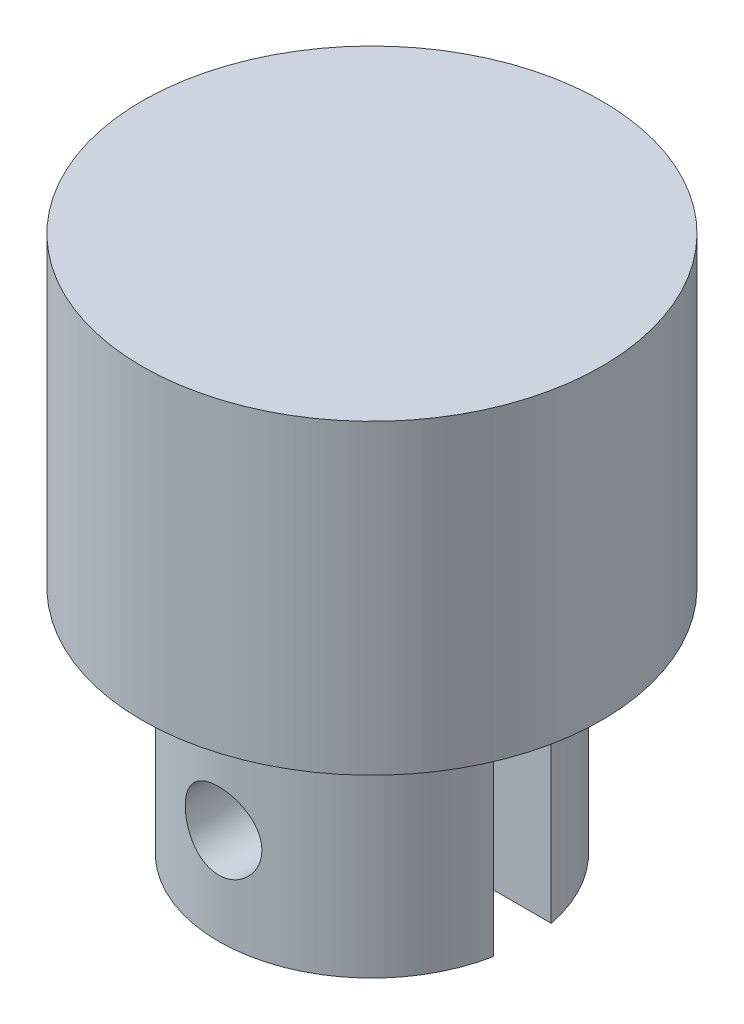
ISO-10303-21;
HEADER;
FILE_DESCRIPTION(('STEP AP214'),'2;1');
FILE_NAME('part.step','',(''),(''),'','','');
FILE_SCHEMA(('AUTOMOTIVE_DESIGN { 1 0 10303 214 1 1 1 1 }'));
ENDSEC;
DATA;
#1=APPLICATION_CONTEXT('core data for automotive mechanical design processes');
#2=APPLICATION_PROTOCOL_DEFINITION('international standard','automotive_design',2000,#1);
#3=PRODUCT_CONTEXT('',#1,'mechanical');
#4=PRODUCT('Part','Part','',(#3));
#5=PRODUCT_RELATED_PRODUCT_CATEGORY('part','',(#4));
#6=PRODUCT_DEFINITION_FORMATION('','',#4);
#7=PRODUCT_DEFINITION_CONTEXT('part definition',#1,'design');
#8=PRODUCT_DEFINITION('design','',#6,#7);
#9=PRODUCT_DEFINITION_SHAPE('','',#8);
#10=(LENGTH_UNIT() NAMED_UNIT(*) SI_UNIT(.MILLI.,.METRE.));
#11=(NAMED_UNIT(*) PLANE_ANGLE_UNIT() SI_UNIT($,.RADIAN.));
#12=(NAMED_UNIT(*) SI_UNIT($,.STERADIAN.) SOLID_ANGLE_UNIT());
#13=UNCERTAINTY_MEASURE_WITH_UNIT(LENGTH_MEASURE(1.E-05),#10,'distance_accuracy_value','');
#14=(GEOMETRIC_REPRESENTATION_CONTEXT(3) GLOBAL_UNCERTAINTY_ASSIGNED_CONTEXT((#13)) GLOBAL_UNIT_ASSIGNED_CONTEXT((#10,
#11,#12)) REPRESENTATION_CONTEXT('',''));
#15=CARTESIAN_POINT('',(0.,0.,0.));
#16=DIRECTION('',(0.,0.,1.));
#17=DIRECTION('',(1.,0.,0.));
#18=AXIS2_PLACEMENT_3D('',#15,#16,#17);
#19=CARTESIAN_POINT('',(0.,-10.,0.));
#20=DIRECTION('',(0.,1.,0.));
#21=DIRECTION('',(0.,0.,1.));
#22=AXIS2_PLACEMENT_3D('',#19,#20,#21);
#23=CYLINDRICAL_SURFACE('',#22,4.);
#24=CARTESIAN_POINT('',(0.,-8.49999999999999,4.));
#25=CARTESIAN_POINT('',(-0.0552507257798204,-8.49999844950789,3.99999906578675));
#26=CARTESIAN_POINT('',(-0.110518771887175,-8.49540563281747,3.99884385421219));
#27=CARTESIAN_POINT('',(-0.219470882513687,-8.47718323246199,3.99434742553262));
#28=CARTESIAN_POINT('',(-0.273154031247158,-8.46354852697476,3.99100496946646));
#29=CARTESIAN_POINT('',(-0.377347248121716,-8.4277071643586,3.98250417554693));
#30=CARTESIAN_POINT('',(-0.427861042286666,-8.40551080085647,3.97734801894725));
#31=CARTESIAN_POINT('',(-0.524448087936282,-8.35321240663677,3.96576895871729));
#32=CARTESIAN_POINT('',(-0.570521189565837,-8.32311010925404,3.95934601236034));
#33=CARTESIAN_POINT('',(-0.657867951533943,-8.25519947356385,3.94578275727868));
#34=CARTESIAN_POINT('',(-0.699037126707377,-8.21725895002721,3.93863138099022));
#35=CARTESIAN_POINT('',(-0.774499284802198,-8.13503186339405,3.92449080078353));
#36=CARTESIAN_POINT('',(-0.808791491299418,-8.09074458470233,3.91750161525566));
#37=CARTESIAN_POINT('',(-0.87001769519935,-7.99626984884171,3.9043651713314));
#38=CARTESIAN_POINT('',(-0.896834810616899,-7.94600451279306,3.89823196313737));
#39=CARTESIAN_POINT('',(-0.941597939033679,-7.84150105889442,3.88766329874816));
#40=CARTESIAN_POINT('',(-0.959545370292883,-7.78726357778282,3.88322757115193));
#41=CARTESIAN_POINT('',(-0.985703224536188,-7.67750433453168,3.87666984478367));
#42=CARTESIAN_POINT('',(-0.99410151222222,-7.62203006930013,3.87450327383617));
#43=CARTESIAN_POINT('',(-1.00150785004523,-7.51042095399068,3.87259575025161));
#44=CARTESIAN_POINT('',(-1.00051742787865,-7.45428621286759,3.87285440299096));
#45=CARTESIAN_POINT('',(-0.989324349759514,-7.34438946150368,3.87572803664412));
#46=CARTESIAN_POINT('',(-0.979345560127007,-7.29060291902327,3.87828575334586));
#47=CARTESIAN_POINT('',(-0.950816124602065,-7.18549263272581,3.88537806450989));
#48=CARTESIAN_POINT('',(-0.932264868046276,-7.13416906464735,3.88991279980464));
#49=CARTESIAN_POINT('',(-0.886926318624763,-7.03484132249862,3.90050075936125));
#50=CARTESIAN_POINT('',(-0.860057778155268,-6.98687588547363,3.90656884979614));
#51=CARTESIAN_POINT('',(-0.798904184009964,-6.89605419349544,3.91953140564257));
#52=CARTESIAN_POINT('',(-0.764617832539221,-6.85319883462183,3.9264260155649));
#53=CARTESIAN_POINT('',(-0.688442283120807,-6.7725309228704,3.94050587026521));
#54=CARTESIAN_POINT('',(-0.646364172110569,-6.73489700662577,3.94769379651981));
#55=CARTESIAN_POINT('',(-0.556407945002462,-6.6671858383574,3.96137310385857));
#56=CARTESIAN_POINT('',(-0.508529651805292,-6.63710881715763,3.96786446366277));
#57=CARTESIAN_POINT('',(-0.408077259120924,-6.58529960918375,3.97945154729455));
#58=CARTESIAN_POINT('',(-0.355487595472412,-6.56359643983039,3.9845424008515));
#59=CARTESIAN_POINT('',(-0.247250672095253,-6.52938846286029,3.99271944660946));
#60=CARTESIAN_POINT('',(-0.191603999433654,-6.51688189572125,3.99580602226187));
#61=CARTESIAN_POINT('',(-0.080359980260016,-6.50169495629411,3.9995699951425));
#62=CARTESIAN_POINT('',(-0.0247978133254717,-6.4987713159498,4.00030702338852));
#63=CARTESIAN_POINT('',(0.0860219165343394,-6.50216600137033,3.999458698763));
#64=CARTESIAN_POINT('',(0.14127950642973,-6.50848349519943,3.99787355494564));
#65=CARTESIAN_POINT('',(0.249076179184327,-6.52998060559426,3.99259720751571));
#66=CARTESIAN_POINT('',(0.301643412645836,-6.54502750898466,3.98893756123874));
#67=CARTESIAN_POINT('',(0.403504861635006,-6.58340472268564,3.97992471089423));
#68=CARTESIAN_POINT('',(0.452798746021755,-6.60673586954212,3.97457133579928));
#69=CARTESIAN_POINT('',(0.547682089619896,-6.66149075258316,3.96262205284207));
#70=CARTESIAN_POINT('',(0.593190294557217,-6.69305074159785,3.95600578244621));
#71=CARTESIAN_POINT('',(0.678351075762161,-6.76319327253132,3.94229672791613));
#72=CARTESIAN_POINT('',(0.718002639315335,-6.80177702641128,3.93520386167803));
#73=CARTESIAN_POINT('',(0.791327045381816,-6.88600130722965,3.92112637973847));
#74=CARTESIAN_POINT('',(0.82482924508135,-6.93179180200162,3.91414869458187));
#75=CARTESIAN_POINT('',(0.883673839341793,-7.02848842297715,3.90128585584826));
#76=CARTESIAN_POINT('',(0.909016596105286,-7.07939432197317,3.89540065378017));
#77=CARTESIAN_POINT('',(0.950634280406189,-7.18460381494205,3.88545396489777));
#78=CARTESIAN_POINT('',(0.966962931102704,-7.23888508556267,3.88138170194604));
#79=CARTESIAN_POINT('',(0.99023043996918,-7.34953975859274,3.87551162726789));
#80=CARTESIAN_POINT('',(0.997171351652432,-7.40591270068833,3.87371331813291));
#81=CARTESIAN_POINT('',(1.00135906022266,-7.51741401590347,3.87263267469305));
#82=CARTESIAN_POINT('',(0.998878598520072,-7.57253162341649,3.87327955152176));
#83=CARTESIAN_POINT('',(0.984918185541905,-7.68153592577865,3.87685272671895));
#84=CARTESIAN_POINT('',(0.973438415124507,-7.73542264534243,3.87977897927905));
#85=CARTESIAN_POINT('',(0.941954212961857,-7.84013897271027,3.88754173788482));
#86=CARTESIAN_POINT('',(0.922000936453577,-7.89098487016014,3.89236676824206));
#87=CARTESIAN_POINT('',(0.874176609070041,-7.98864358847579,3.90338503816553));
#88=CARTESIAN_POINT('',(0.846304460022786,-8.03545584879128,3.90957846747182));
#89=CARTESIAN_POINT('',(0.782578499091419,-8.12503641933468,3.92283756175675));
#90=CARTESIAN_POINT('',(0.746535441941498,-8.16766738228264,3.92992176554505));
#91=CARTESIAN_POINT('',(0.667859580793152,-8.24636469653027,3.94405351497524));
#92=CARTESIAN_POINT('',(0.625225214174092,-8.28242948674198,3.95110105151373));
#93=CARTESIAN_POINT('',(0.533645057801722,-8.34760753904307,3.96451770431775));
#94=CARTESIAN_POINT('',(0.48459894821092,-8.37658307578105,3.97087222243912));
#95=CARTESIAN_POINT('',(0.38217737300698,-8.42583164196035,3.98203283316746));
#96=CARTESIAN_POINT('',(0.328805042291156,-8.44611090709902,3.98684003466521));
#97=CARTESIAN_POINT('',(0.229606835495646,-8.47438122021976,3.99365373043694));
#98=CARTESIAN_POINT('',(0.184253447272044,-8.48396749536895,3.9960172336846));
#99=CARTESIAN_POINT('',(0.0926040476908547,-8.49677729574795,3.99919070154632));
#100=CARTESIAN_POINT('',(0.0463081074950771,-8.50000129953686,4.00000078300596));
#101=CARTESIAN_POINT('',(0.,-8.49999999999999,4.));
#102=B_SPLINE_CURVE_WITH_KNOTS('',3,(#24,#25,#26,#27,#28,#29,#30,#31,#32,#33,#34,#35,#36,#37,
#38,#39,#40,#41,#42,#43,#44,#45,#46,#47,#48,#49,#50,#51,#52,#53,#54,#55,#56,#57,#58,#59,#60,#61,
#62,#63,#64,#65,#66,#67,#68,#69,#70,#71,#72,#73,#74,#75,#76,#77,#78,#79,#80,#81,#82,#83,#84,#85,
#86,#87,#88,#89,#90,#91,#92,#93,#94,#95,#96,#97,#98,#99,#100,#101),.UNSPECIFIED.,.T.,.F.,(4,2,2,
2,2,2,2,2,2,2,2,2,2,2,2,2,2,2,2,2,2,2,2,2,2,2,2,2,2,2,2,2,2,2,2,2,2,2,4),(0.,0.165582474981259,
0.331258825175931,0.496736601524068,0.662219960112882,0.830762902914254,0.999324863867073,
1.1703909836387,1.34142974112911,1.50904196732953,1.6766269207513,1.84014998004678,
2.00368468977358,2.16887018582585,2.3340846055744,2.50401000646011,2.67394059705496,
2.84445486006074,3.0149364912576,3.18105539299516,3.3471593407516,3.51080183009356,
3.67446084881525,3.84102391710232,4.00761575338677,4.17829672802981,4.34897012499669,
4.51861503076022,4.68822282168269,4.85295853599072,5.01769093970687,5.18144267039628,
5.34521712091264,5.5132638427327,5.68135046513608,5.85248123666388,6.0234890921423,
6.16228161961429,6.30106370695356),.UNSPECIFIED.);
#103=CARTESIAN_POINT('',(0.,-8.49999999999999,4.));
#104=VERTEX_POINT('',#103);
#105=EDGE_CURVE('E12',#104,#104,#102,.T.);
#106=ORIENTED_EDGE('',*,*,#105,.T.);
#107=EDGE_LOOP('',(#106));
#108=FACE_BOUND('',#107,.T.);
#109=DIRECTION('',(0.,1.,0.));
#110=VECTOR('',#109,1.);
#111=CARTESIAN_POINT('',(-3.92905841137543,-10.,0.749999999999998));
#112=LINE('',#111,#110);
#113=CARTESIAN_POINT('',(-3.92905841137542,-10.,0.749999999999998));
#114=VERTEX_POINT('',#113);
#115=CARTESIAN_POINT('',(-3.92905841137543,-4.,0.749999999999999));
#116=VERTEX_POINT('',#115);
#117=EDGE_CURVE('E85',#114,#116,#112,.T.);
#118=ORIENTED_EDGE('',*,*,#117,.F.);
#119=CARTESIAN_POINT('',(0.,-10.,0.));
#120=DIRECTION('',(0.,-1.,0.));
#121=DIRECTION('',(0.,0.,-1.));
#122=AXIS2_PLACEMENT_3D('',#119,#120,#121);
#123=CIRCLE('',#122,4.);
#124=CARTESIAN_POINT('',(3.92905841137543,-10.,0.749999999999998));
#125=VERTEX_POINT('',#124);
#126=EDGE_CURVE('E94',#125,#114,#123,.T.);
#127=ORIENTED_EDGE('',*,*,#126,.F.);
#128=DIRECTION('',(0.,1.,0.));
#129=VECTOR('',#128,1.);
#130=CARTESIAN_POINT('',(3.92905841137543,-10.,0.749999999999998));
#131=LINE('',#130,#129);
#132=CARTESIAN_POINT('',(3.92905841137543,-4.,0.749999999999999));
#133=VERTEX_POINT('',#132);
#134=EDGE_CURVE('E82',#133,#125,#131,.F.);
#135=ORIENTED_EDGE('',*,*,#134,.F.);
#136=CARTESIAN_POINT('',(0.,-4.,0.));
#137=DIRECTION('',(0.,-1.,0.));
#138=DIRECTION('',(0.,0.,-1.));
#139=AXIS2_PLACEMENT_3D('',#136,#137,#138);
#140=CIRCLE('',#139,4.);
#141=EDGE_CURVE('E92',#133,#116,#140,.T.);
#142=ORIENTED_EDGE('',*,*,#141,.T.);
#143=EDGE_LOOP('',(#118,#127,#135,#142));
#144=FACE_BOUND('',#143,.T.);
#145=ADVANCED_FACE('F36',(#108,#144),#23,.T.);
#146=CARTESIAN_POINT('',(0.,-10.,0.));
#147=DIRECTION('',(0.,-1.,0.));
#148=DIRECTION('',(0.,0.,-1.));
#149=AXIS2_PLACEMENT_3D('',#146,#147,#148);
#150=PLANE('',#149);
#151=ORIENTED_EDGE('',*,*,#126,.T.);
#152=DIRECTION('',(-1.,0.,0.));
#153=VECTOR('',#152,1.);
#154=CARTESIAN_POINT('',(6.,-10.,0.749999999999998));
#155=LINE('',#154,#153);
#156=EDGE_CURVE('E154',#125,#114,#155,.T.);
#157=ORIENTED_EDGE('',*,*,#156,.F.);
#158=EDGE_LOOP('',(#151,#157));
#159=FACE_BOUND('',#158,.T.);
#160=ADVANCED_FACE('F130',(#159),#150,.T.);
#161=CARTESIAN_POINT('',(0.,4.,0.));
#162=DIRECTION('',(0.,-1.,0.));
#163=DIRECTION('',(0.,0.,-1.));
#164=AXIS2_PLACEMENT_3D('',#161,#162,#163);
#165=CYLINDRICAL_SURFACE('',#164,6.);
#166=CARTESIAN_POINT('',(0.,4.,0.));
#167=DIRECTION('',(0.,1.,0.));
#168=DIRECTION('',(0.,0.,1.));
#169=AXIS2_PLACEMENT_3D('',#166,#167,#168);
#170=CIRCLE('',#169,6.);
#171=CARTESIAN_POINT('',(0.,4.,6.));
#172=VERTEX_POINT('',#171);
#173=EDGE_CURVE('E103',#172,#172,#170,.T.);
#174=ORIENTED_EDGE('',*,*,#173,.F.);
#175=EDGE_LOOP('',(#174));
#176=FACE_BOUND('',#175,.T.);
#177=CARTESIAN_POINT('',(0.,-4.,0.));
#178=DIRECTION('',(0.,1.,0.));
#179=DIRECTION('',(0.,0.,1.));
#180=AXIS2_PLACEMENT_3D('',#177,#178,#179);
#181=CIRCLE('',#180,6.);
#182=CARTESIAN_POINT('',(0.,-4.,6.));
#183=VERTEX_POINT('',#182);
#184=EDGE_CURVE('E110',#183,#183,#181,.T.);
#185=ORIENTED_EDGE('',*,*,#184,.T.);
#186=EDGE_LOOP('',(#185));
#187=FACE_BOUND('',#186,.T.);
#188=ADVANCED_FACE('F38',(#176,#187),#165,.T.);
#189=CARTESIAN_POINT('',(0.,4.,0.));
#190=DIRECTION('',(0.,1.,0.));
#191=DIRECTION('',(0.,0.,1.));
#192=AXIS2_PLACEMENT_3D('',#189,#190,#191);
#193=PLANE('',#192);
#194=ORIENTED_EDGE('',*,*,#173,.T.);
#195=EDGE_LOOP('',(#194));
#196=FACE_BOUND('',#195,.T.);
#197=ADVANCED_FACE('F173',(#196),#193,.T.);
#198=CARTESIAN_POINT('',(0.,-4.,0.));
#199=DIRECTION('',(0.,1.,0.));
#200=DIRECTION('',(0.,0.,1.));
#201=AXIS2_PLACEMENT_3D('',#198,#199,#200);
#202=PLANE('',#201);
#203=ORIENTED_EDGE('',*,*,#141,.F.);
#204=DIRECTION('',(-1.,0.,0.));
#205=VECTOR('',#204,1.);
#206=CARTESIAN_POINT('',(6.,-4.,0.749999999999999));
#207=LINE('',#206,#205);
#208=EDGE_CURVE('E79',#133,#116,#207,.T.);
#209=ORIENTED_EDGE('',*,*,#208,.T.);
#210=EDGE_LOOP('',(#203,#209));
#211=FACE_BOUND('',#210,.T.);
#212=DIRECTION('',(-1.,0.,0.));
#213=VECTOR('',#212,1.);
#214=CARTESIAN_POINT('',(6.,-4.,-0.75));
#215=LINE('',#214,#213);
#216=CARTESIAN_POINT('',(3.92905841137543,-4.,-0.75));
#217=VERTEX_POINT('',#216);
#218=CARTESIAN_POINT('',(-3.92905841137543,-4.,-0.75));
#219=VERTEX_POINT('',#218);
#220=EDGE_CURVE('E61',#217,#219,#215,.T.);
#221=ORIENTED_EDGE('',*,*,#220,.F.);
#222=EDGE_CURVE('E99',#219,#217,#140,.T.);
#223=ORIENTED_EDGE('',*,*,#222,.F.);
#224=EDGE_LOOP('',(#221,#223));
#225=FACE_BOUND('',#224,.T.);
#226=ORIENTED_EDGE('',*,*,#184,.F.);
#227=EDGE_LOOP('',(#226));
#228=FACE_BOUND('',#227,.T.);
#229=ADVANCED_FACE('F97',(#211,#225,#228),#202,.F.);
#230=CARTESIAN_POINT('',(-0.999999999999994,-7.5,-3.87298334620742));
#231=CARTESIAN_POINT('',(-0.999998431438693,-7.55522030035679,-3.87298440057185));
#232=CARTESIAN_POINT('',(-0.995410498208063,-7.61045795943136,-3.87417722499279));
#233=CARTESIAN_POINT('',(-0.97720925019444,-7.71934703123261,-3.87880744892249));
#234=CARTESIAN_POINT('',(-0.963590682698071,-7.77299750177996,-3.88224615474181));
#235=CARTESIAN_POINT('',(-0.927796479849629,-7.87712141528784,-3.89095489813012));
#236=CARTESIAN_POINT('',(-0.905631891140938,-7.92759886215776,-3.8962225706936));
#237=CARTESIAN_POINT('',(-0.853408456505401,-8.02412434101247,-3.90799276818327));
#238=CARTESIAN_POINT('',(-0.823349275424499,-8.07017218483114,-3.91449534553241));
#239=CARTESIAN_POINT('',(-0.755483370924512,-8.15754465810584,-3.92816286540368));
#240=CARTESIAN_POINT('',(-0.717534755081553,-8.19875744014027,-3.93533839048709));
#241=CARTESIAN_POINT('',(-0.635272825640324,-8.27430455774387,-3.94945150206622));
#242=CARTESIAN_POINT('',(-0.590958917672135,-8.30863825024862,-3.95638906626691));
#243=CARTESIAN_POINT('',(-0.49645808043156,-8.36991018705258,-3.96936166208095));
#244=CARTESIAN_POINT('',(-0.446197830478039,-8.3967385552646,-3.975382749602));
#245=CARTESIAN_POINT('',(-0.341705273717106,-8.44152385766121,-3.9857232477043));
#246=CARTESIAN_POINT('',(-0.287473554316773,-8.45948210076619,-3.99004290933747));
#247=CARTESIAN_POINT('',(-0.17774350350166,-8.48565913383143,-3.99641903539262));
#248=CARTESIAN_POINT('',(-0.122293087819587,-8.49406785773063,-3.99851957537723));
#249=CARTESIAN_POINT('',(-0.0107315277051062,-8.50150335171022,-4.00037437642922));
#250=CARTESIAN_POINT('',(0.0453795178152288,-8.50053150888383,-4.00012898438682));
#251=CARTESIAN_POINT('',(0.155352247172388,-8.48937005989994,-3.99735237981413));
#252=CARTESIAN_POINT('',(0.209236215601067,-8.47938546997845,-3.99487200936349));
#253=CARTESIAN_POINT('',(0.314538247413686,-8.45081149198059,-3.98796334609942));
#254=CARTESIAN_POINT('',(0.365956179370437,-8.43222164584903,-3.98353494959376));
#255=CARTESIAN_POINT('',(0.465406703501806,-8.38679897172517,-3.97315003880358));
#256=CARTESIAN_POINT('',(0.513404509766503,-8.35989318213529,-3.96718007878021));
#257=CARTESIAN_POINT('',(0.604275622340487,-8.29865772835349,-3.9543596152386));
#258=CARTESIAN_POINT('',(0.647148035085503,-8.26432677257575,-3.94750895860996));
#259=CARTESIAN_POINT('',(0.727774035084953,-8.18811650320704,-3.93345485507808));
#260=CARTESIAN_POINT('',(0.765357679075195,-8.14605804306089,-3.92624687810367));
#261=CARTESIAN_POINT('',(0.832976375963014,-8.05616001058389,-3.91246017406683));
#262=CARTESIAN_POINT('',(0.863011076046012,-8.0083201682036,-3.90588147642388));
#263=CARTESIAN_POINT('',(0.914788129022593,-7.90788398634041,-3.89408198732659));
#264=CARTESIAN_POINT('',(0.936489566970486,-7.85526570787472,-3.88886793490288));
#265=CARTESIAN_POINT('',(0.970685620636335,-7.74696581276942,-3.88047456055983));
#266=CARTESIAN_POINT('',(0.983182206552904,-7.69128485440674,-3.87729480324088));
#267=CARTESIAN_POINT('',(0.998331855466065,-7.58001619939075,-3.87342142415656));
#268=CARTESIAN_POINT('',(1.00123618956785,-7.52446488266815,-3.87266435637459));
#269=CARTESIAN_POINT('',(0.997806796206212,-7.41367122536874,-3.87354937392416));
#270=CARTESIAN_POINT('',(0.991473919139514,-7.3584288568195,-3.87519123840507));
#271=CARTESIAN_POINT('',(0.969970185575058,-7.25075429401812,-3.88062832781824));
#272=CARTESIAN_POINT('',(0.954945627312692,-7.19829090937166,-3.8843878809375));
#273=CARTESIAN_POINT('',(0.916647232668242,-7.09662741685933,-3.89360287308385));
#274=CARTESIAN_POINT('',(0.893372419085011,-7.04742769637786,-3.89905851299446));
#275=CARTESIAN_POINT('',(0.838708267174616,-6.95262348885306,-3.91118454837305));
#276=CARTESIAN_POINT('',(0.807168701534245,-6.90710846398276,-3.91787667442657));
#277=CARTESIAN_POINT('',(0.73706029293445,-6.82192465487946,-3.93166833228686));
#278=CARTESIAN_POINT('',(0.698490294805434,-6.78225683333997,-3.93876793091388));
#279=CARTESIAN_POINT('',(0.614262720984721,-6.70887558297162,-3.95278961212643));
#280=CARTESIAN_POINT('',(0.568451952531588,-6.67533597498048,-3.95970280824734));
#281=CARTESIAN_POINT('',(0.471702682694671,-6.61642565321951,-3.97238886645494));
#282=CARTESIAN_POINT('',(0.420764448957587,-6.59105451335672,-3.97816178801584));
#283=CARTESIAN_POINT('',(0.315558201731087,-6.54942158618883,-3.98788046295326));
#284=CARTESIAN_POINT('',(0.261317381027878,-6.53309428624838,-3.99183932008964));
#285=CARTESIAN_POINT('',(0.150749760318805,-6.50981586615664,-3.99754117358315));
#286=CARTESIAN_POINT('',(0.0944233650412413,-6.50286293650439,-3.99928459757363));
#287=CARTESIAN_POINT('',(-0.0170835264433276,-6.49863241042447,-4.00034169408811));
#288=CARTESIAN_POINT('',(-0.0722538269660339,-6.50109829090462,-3.99971978880008));
#289=CARTESIAN_POINT('',(-0.18136749641474,-6.51504782729434,-3.99625896457423));
#290=CARTESIAN_POINT('',(-0.235310901780886,-6.52653121501311,-3.99342011157094));
#291=CARTESIAN_POINT('',(-0.340171035644816,-6.55805221977093,-3.98585432853963));
#292=CARTESIAN_POINT('',(-0.391102494581018,-6.57804345331463,-3.98113764502669));
#293=CARTESIAN_POINT('',(-0.488917053041467,-6.62597057901933,-3.97031288913382));
#294=CARTESIAN_POINT('',(-0.535799641265049,-6.65390747266957,-3.96420464137727));
#295=CARTESIAN_POINT('',(-0.625401928423898,-6.71771523399708,-3.95107249681342));
#296=CARTESIAN_POINT('',(-0.667994988300584,-6.75376014290737,-3.94403016945647));
#297=CARTESIAN_POINT('',(-0.746615020271248,-6.83242285197381,-3.92990649053207));
#298=CARTESIAN_POINT('',(-0.782640325068174,-6.87504231609795,-3.92282512952424));
#299=CARTESIAN_POINT('',(-0.847762026479236,-6.9666014142013,-3.90927475860683));
#300=CARTESIAN_POINT('',(-0.876716619446589,-7.01564412341249,-3.90281963730391));
#301=CARTESIAN_POINT('',(-0.925926896615617,-7.11805548992285,-3.8914395555011));
#302=CARTESIAN_POINT('',(-0.946188909759551,-7.17142096610729,-3.88651348244814));
#303=CARTESIAN_POINT('',(-0.974422528565566,-7.27057701182628,-3.87951908741315));
#304=CARTESIAN_POINT('',(-0.983993170595823,-7.31589316438236,-3.87708663005761));
#305=CARTESIAN_POINT('',(-0.996782292572813,-7.40746886900147,-3.87381838580358));
#306=CARTESIAN_POINT('',(-1.00000131437051,-7.45372834025063,-3.87298246270639));
#307=CARTESIAN_POINT('',(-0.999999999999994,-7.5,-3.87298334620742));
#308=B_SPLINE_CURVE_WITH_KNOTS('',3,(#230,#231,#232,#233,#234,#235,#236,#237,#238,#239,#240,
#241,#242,#243,#244,#245,#246,#247,#248,#249,#250,#251,#252,#253,#254,#255,#256,#257,#258,#259,
#260,#261,#262,#263,#264,#265,#266,#267,#268,#269,#270,#271,#272,#273,#274,#275,#276,#277,#278,
#279,#280,#281,#282,#283,#284,#285,#286,#287,#288,#289,#290,#291,#292,#293,#294,#295,#296,#297,
#298,#299,#300,#301,#302,#303,#304,#305,#306,#307),.UNSPECIFIED.,.T.,.F.,(4,2,2,2,2,2,2,2,2,2,2,
2,2,2,2,2,2,2,2,2,2,2,2,2,2,2,2,2,2,2,2,2,2,2,2,2,2,2,4),(0.,0.16549097667523,0.33107829653421,
0.496452290829149,0.661833306984655,0.830495816734645,0.999174085882206,1.17020598555442,
1.34121263935111,1.50875500394412,1.67627259462682,1.84007305071852,2.00388222686188,
2.16917149698051,2.33448954183839,2.50428186625038,2.67408212476194,2.84470572799634,
3.01529280048092,3.1813742990096,3.34744050869793,3.51078961999955,3.6741580856484,
3.84073138339935,4.0073320755029,4.178101323824,4.34886166284093,4.51836829119044,
4.68784219559887,4.85273378447254,5.01762046947064,5.18161950620156,5.345639222915,
5.513588386291,5.68158012622475,5.85270590910142,6.02370688542919,6.16239130867203,
6.30106390036079),.UNSPECIFIED.);
#309=CARTESIAN_POINT('',(-0.999999999999994,-7.5,-3.87298334620742));
#310=VERTEX_POINT('',#309);
#311=EDGE_CURVE('E49',#310,#310,#308,.T.);
#312=ORIENTED_EDGE('',*,*,#311,.T.);
#313=EDGE_LOOP('',(#312));
#314=FACE_BOUND('',#313,.T.);
#315=CARTESIAN_POINT('',(-3.92905841137543,-10.,-0.750000000000002));
#316=VERTEX_POINT('',#315);
#317=CARTESIAN_POINT('',(3.92905841137543,-10.,-0.750000000000002));
#318=VERTEX_POINT('',#317);
#319=EDGE_CURVE('E106',#316,#318,#123,.T.);
#320=ORIENTED_EDGE('',*,*,#319,.F.);
#321=DIRECTION('',(0.,1.,0.));
#322=VECTOR('',#321,1.);
#323=CARTESIAN_POINT('',(-3.92905841137543,-10.,-0.750000000000001));
#324=LINE('',#323,#322);
#325=EDGE_CURVE('E56',#316,#219,#324,.T.);
#326=ORIENTED_EDGE('',*,*,#325,.T.);
#327=ORIENTED_EDGE('',*,*,#222,.T.);
#328=DIRECTION('',(0.,1.,0.));
#329=VECTOR('',#328,1.);
#330=CARTESIAN_POINT('',(3.92905841137543,-10.,-0.750000000000001));
#331=LINE('',#330,#329);
#332=EDGE_CURVE('E164',#217,#318,#331,.F.);
#333=ORIENTED_EDGE('',*,*,#332,.T.);
#334=EDGE_LOOP('',(#320,#326,#327,#333));
#335=FACE_BOUND('',#334,.T.);
#336=ADVANCED_FACE('F116',(#314,#335),#23,.T.);
#337=DIRECTION('',(-1.,0.,0.));
#338=VECTOR('',#337,1.);
#339=CARTESIAN_POINT('',(6.,-10.,-0.750000000000002));
#340=LINE('',#339,#338);
#341=EDGE_CURVE('E156',#318,#316,#340,.T.);
#342=ORIENTED_EDGE('',*,*,#341,.T.);
#343=ORIENTED_EDGE('',*,*,#319,.T.);
#344=EDGE_LOOP('',(#342,#343));
#345=FACE_BOUND('',#344,.T.);
#346=ADVANCED_FACE('F124',(#345),#150,.T.);
#347=CARTESIAN_POINT('',(0.,-7.5,-4.));
#348=DIRECTION('',(0.,0.,-1.));
#349=DIRECTION('',(-1.,0.,0.));
#350=AXIS2_PLACEMENT_3D('',#347,#348,#349);
#351=CYLINDRICAL_SURFACE('',#350,0.999999999999994);
#352=CARTESIAN_POINT('',(0.,-7.5,-0.750000000000001));
#353=DIRECTION('',(0.,0.,-1.));
#354=DIRECTION('',(0.,1.,0.));
#355=AXIS2_PLACEMENT_3D('',#352,#353,#354);
#356=CIRCLE('',#355,1.);
#357=CARTESIAN_POINT('',(0.,-6.5,-0.750000000000001));
#358=VERTEX_POINT('',#357);
#359=EDGE_CURVE('E161',#358,#358,#356,.F.);
#360=ORIENTED_EDGE('',*,*,#359,.T.);
#361=EDGE_LOOP('',(#360));
#362=FACE_BOUND('',#361,.T.);
#363=ORIENTED_EDGE('',*,*,#311,.F.);
#364=EDGE_LOOP('',(#363));
#365=FACE_BOUND('',#364,.T.);
#366=ADVANCED_FACE('F120',(#362,#365),#351,.F.);
#367=CARTESIAN_POINT('',(0.,-7.5,4.));
#368=DIRECTION('',(0.,0.,1.));
#369=DIRECTION('',(1.,0.,0.));
#370=AXIS2_PLACEMENT_3D('',#367,#368,#369);
#371=CYLINDRICAL_SURFACE('',#370,0.999999999999994);
#372=CARTESIAN_POINT('',(0.,-7.5,0.749999999999999));
#373=DIRECTION('',(0.,0.,-1.));
#374=DIRECTION('',(0.,1.,0.));
#375=AXIS2_PLACEMENT_3D('',#372,#373,#374);
#376=CIRCLE('',#375,0.999999999999997);
#377=CARTESIAN_POINT('',(0.,-6.5,0.749999999999999));
#378=VERTEX_POINT('',#377);
#379=EDGE_CURVE('E95',#378,#378,#376,.F.);
#380=ORIENTED_EDGE('',*,*,#379,.F.);
#381=EDGE_LOOP('',(#380));
#382=FACE_BOUND('',#381,.T.);
#383=ORIENTED_EDGE('',*,*,#105,.F.);
#384=EDGE_LOOP('',(#383));
#385=FACE_BOUND('',#384,.T.);
#386=ADVANCED_FACE('F123',(#382,#385),#371,.F.);
#387=CARTESIAN_POINT('',(6.,-4.,-0.75));
#388=DIRECTION('',(0.,0.,-1.));
#389=DIRECTION('',(0.,1.,0.));
#390=AXIS2_PLACEMENT_3D('',#387,#388,#389);
#391=PLANE('',#390);
#392=ORIENTED_EDGE('',*,*,#359,.F.);
#393=EDGE_LOOP('',(#392));
#394=FACE_BOUND('',#393,.T.);
#395=ORIENTED_EDGE('',*,*,#341,.F.);
#396=ORIENTED_EDGE('',*,*,#332,.F.);
#397=ORIENTED_EDGE('',*,*,#220,.T.);
#398=ORIENTED_EDGE('',*,*,#325,.F.);
#399=EDGE_LOOP('',(#395,#396,#397,#398));
#400=FACE_BOUND('',#399,.T.);
#401=ADVANCED_FACE('F144',(#394,#400),#391,.F.);
#402=CARTESIAN_POINT('',(6.,-4.,0.749999999999999));
#403=DIRECTION('',(0.,0.,-1.));
#404=DIRECTION('',(0.,1.,0.));
#405=AXIS2_PLACEMENT_3D('',#402,#403,#404);
#406=PLANE('',#405);
#407=ORIENTED_EDGE('',*,*,#379,.T.);
#408=EDGE_LOOP('',(#407));
#409=FACE_BOUND('',#408,.T.);
#410=ORIENTED_EDGE('',*,*,#117,.T.);
#411=ORIENTED_EDGE('',*,*,#208,.F.);
#412=ORIENTED_EDGE('',*,*,#134,.T.);
#413=ORIENTED_EDGE('',*,*,#156,.T.);
#414=EDGE_LOOP('',(#410,#411,#412,#413));
#415=FACE_BOUND('',#414,.T.);
#416=ADVANCED_FACE('F81',(#409,#415),#406,.T.);
#417=CLOSED_SHELL('',(#145,#160,#188,#197,#229,#336,#346,#366,#386,#401,#416));
#418=MANIFOLD_SOLID_BREP('B2',#417);
#419=ADVANCED_BREP_SHAPE_REPRESENTATION('',(#18,#418),#14);
#420=SHAPE_DEFINITION_REPRESENTATION(#9,#419);
ENDSEC;
END-ISO-10303-21;
